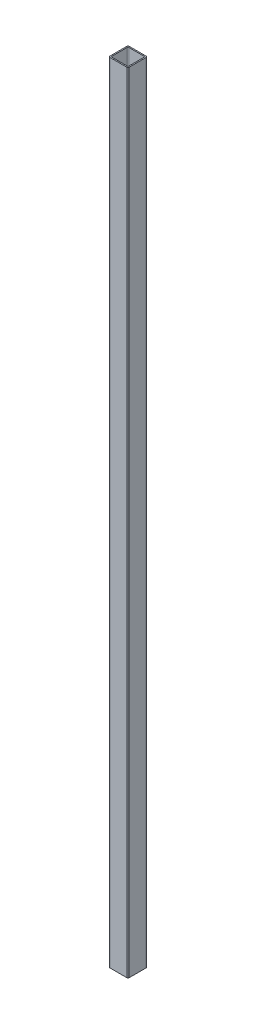
ISO-10303-21;
HEADER;
FILE_DESCRIPTION(('STEP AP214'),'2;1');
FILE_NAME('part.step','',(''),(''),'','','');
FILE_SCHEMA(('AUTOMOTIVE_DESIGN { 1 0 10303 214 1 1 1 1 }'));
ENDSEC;
DATA;
#1=APPLICATION_CONTEXT('core data for automotive mechanical design processes');
#2=APPLICATION_PROTOCOL_DEFINITION('international standard','automotive_design',2000,#1);
#3=PRODUCT_CONTEXT('',#1,'mechanical');
#4=PRODUCT('Part','Part','',(#3));
#5=PRODUCT_RELATED_PRODUCT_CATEGORY('part','',(#4));
#6=PRODUCT_DEFINITION_FORMATION('','',#4);
#7=PRODUCT_DEFINITION_CONTEXT('part definition',#1,'design');
#8=PRODUCT_DEFINITION('design','',#6,#7);
#9=PRODUCT_DEFINITION_SHAPE('','',#8);
#10=(LENGTH_UNIT() NAMED_UNIT(*) SI_UNIT(.MILLI.,.METRE.));
#11=(NAMED_UNIT(*) PLANE_ANGLE_UNIT() SI_UNIT($,.RADIAN.));
#12=(NAMED_UNIT(*) SI_UNIT($,.STERADIAN.) SOLID_ANGLE_UNIT());
#13=UNCERTAINTY_MEASURE_WITH_UNIT(LENGTH_MEASURE(1.E-05),#10,'distance_accuracy_value','');
#14=(GEOMETRIC_REPRESENTATION_CONTEXT(3) GLOBAL_UNCERTAINTY_ASSIGNED_CONTEXT((#13)) GLOBAL_UNIT_ASSIGNED_CONTEXT((#10,
#11,#12)) REPRESENTATION_CONTEXT('',''));
#15=CARTESIAN_POINT('',(0.,0.,0.));
#16=DIRECTION('',(0.,0.,1.));
#17=DIRECTION('',(1.,0.,0.));
#18=AXIS2_PLACEMENT_3D('',#15,#16,#17);
#19=CARTESIAN_POINT('',(3.,0.,22.));
#20=DIRECTION('',(0.,1.,0.));
#21=DIRECTION('',(0.,0.,1.));
#22=AXIS2_PLACEMENT_3D('',#19,#20,#21);
#23=PLANE('',#22);
#24=CARTESIAN_POINT('',(3.,0.,22.));
#25=DIRECTION('',(0.,1.,0.));
#26=DIRECTION('',(0.,0.,1.));
#27=AXIS2_PLACEMENT_3D('',#24,#25,#26);
#28=CIRCLE('',#27,3.);
#29=CARTESIAN_POINT('',(0.,0.,22.));
#30=VERTEX_POINT('',#29);
#31=CARTESIAN_POINT('',(3.,0.,25.));
#32=VERTEX_POINT('',#31);
#33=EDGE_CURVE('E176',#30,#32,#28,.T.);
#34=ORIENTED_EDGE('',*,*,#33,.F.);
#35=DIRECTION('',(0.,0.,1.));
#36=VECTOR('',#35,1.);
#37=CARTESIAN_POINT('',(0.,0.,-22.));
#38=LINE('',#37,#36);
#39=CARTESIAN_POINT('',(0.,0.,-22.));
#40=VERTEX_POINT('',#39);
#41=EDGE_CURVE('E130',#40,#30,#38,.T.);
#42=ORIENTED_EDGE('',*,*,#41,.F.);
#43=CARTESIAN_POINT('',(3.,0.,-22.));
#44=DIRECTION('',(0.,1.,0.));
#45=DIRECTION('',(0.,0.,1.));
#46=AXIS2_PLACEMENT_3D('',#43,#44,#45);
#47=CIRCLE('',#46,3.);
#48=CARTESIAN_POINT('',(3.,0.,-25.));
#49=VERTEX_POINT('',#48);
#50=EDGE_CURVE('E170',#49,#40,#47,.T.);
#51=ORIENTED_EDGE('',*,*,#50,.F.);
#52=DIRECTION('',(-1.,0.,0.));
#53=VECTOR('',#52,1.);
#54=CARTESIAN_POINT('',(3.,0.,-25.));
#55=LINE('',#54,#53);
#56=CARTESIAN_POINT('',(47.,0.,-25.));
#57=VERTEX_POINT('',#56);
#58=EDGE_CURVE('E166',#57,#49,#55,.T.);
#59=ORIENTED_EDGE('',*,*,#58,.F.);
#60=CARTESIAN_POINT('',(47.,0.,-22.));
#61=DIRECTION('',(0.,1.,0.));
#62=DIRECTION('',(0.,0.,-1.));
#63=AXIS2_PLACEMENT_3D('',#60,#61,#62);
#64=CIRCLE('',#63,3.00000000000001);
#65=CARTESIAN_POINT('',(50.,0.,-22.));
#66=VERTEX_POINT('',#65);
#67=EDGE_CURVE('E162',#66,#57,#64,.T.);
#68=ORIENTED_EDGE('',*,*,#67,.F.);
#69=DIRECTION('',(0.,0.,-1.));
#70=VECTOR('',#69,1.);
#71=CARTESIAN_POINT('',(50.,0.,-22.));
#72=LINE('',#71,#70);
#73=CARTESIAN_POINT('',(50.,0.,22.));
#74=VERTEX_POINT('',#73);
#75=EDGE_CURVE('E158',#74,#66,#72,.T.);
#76=ORIENTED_EDGE('',*,*,#75,.F.);
#77=CARTESIAN_POINT('',(47.,0.,22.));
#78=DIRECTION('',(0.,1.,0.));
#79=DIRECTION('',(0.,0.,1.));
#80=AXIS2_PLACEMENT_3D('',#77,#78,#79);
#81=CIRCLE('',#80,3.);
#82=CARTESIAN_POINT('',(47.,0.,25.));
#83=VERTEX_POINT('',#82);
#84=EDGE_CURVE('E154',#83,#74,#81,.T.);
#85=ORIENTED_EDGE('',*,*,#84,.F.);
#86=DIRECTION('',(1.,0.,0.));
#87=VECTOR('',#86,1.);
#88=CARTESIAN_POINT('',(3.,0.,25.));
#89=LINE('',#88,#87);
#90=EDGE_CURVE('E150',#32,#83,#89,.T.);
#91=ORIENTED_EDGE('',*,*,#90,.F.);
#92=EDGE_LOOP('',(#34,#42,#51,#59,#68,#76,#85,#91));
#93=FACE_BOUND('',#92,.T.);
#94=CARTESIAN_POINT('',(5.00000000000001,0.,20.));
#95=DIRECTION('',(0.,1.,0.));
#96=DIRECTION('',(0.,0.,1.));
#97=AXIS2_PLACEMENT_3D('',#94,#95,#96);
#98=CIRCLE('',#97,2.);
#99=CARTESIAN_POINT('',(3.00000000000001,0.,20.));
#100=VERTEX_POINT('',#99);
#101=CARTESIAN_POINT('',(5.00000000000001,0.,22.));
#102=VERTEX_POINT('',#101);
#103=EDGE_CURVE('E126',#100,#102,#98,.T.);
#104=ORIENTED_EDGE('',*,*,#103,.T.);
#105=DIRECTION('',(1.,0.,0.));
#106=VECTOR('',#105,1.);
#107=CARTESIAN_POINT('',(5.00000000000001,0.,22.));
#108=LINE('',#107,#106);
#109=CARTESIAN_POINT('',(45.,0.,22.));
#110=VERTEX_POINT('',#109);
#111=EDGE_CURVE('E133',#102,#110,#108,.T.);
#112=ORIENTED_EDGE('',*,*,#111,.T.);
#113=CARTESIAN_POINT('',(45.,0.,20.));
#114=DIRECTION('',(0.,1.,0.));
#115=DIRECTION('',(0.,0.,1.));
#116=AXIS2_PLACEMENT_3D('',#113,#114,#115);
#117=CIRCLE('',#116,2.);
#118=CARTESIAN_POINT('',(47.,0.,20.));
#119=VERTEX_POINT('',#118);
#120=EDGE_CURVE('E137',#110,#119,#117,.T.);
#121=ORIENTED_EDGE('',*,*,#120,.T.);
#122=DIRECTION('',(0.,0.,-1.));
#123=VECTOR('',#122,1.);
#124=CARTESIAN_POINT('',(47.,0.,-20.));
#125=LINE('',#124,#123);
#126=CARTESIAN_POINT('',(47.,0.,-20.));
#127=VERTEX_POINT('',#126);
#128=EDGE_CURVE('E242',#119,#127,#125,.T.);
#129=ORIENTED_EDGE('',*,*,#128,.T.);
#130=CARTESIAN_POINT('',(45.,0.,-20.));
#131=DIRECTION('',(0.,1.,0.));
#132=DIRECTION('',(0.,0.,-1.));
#133=AXIS2_PLACEMENT_3D('',#130,#131,#132);
#134=CIRCLE('',#133,2.);
#135=CARTESIAN_POINT('',(45.,0.,-22.));
#136=VERTEX_POINT('',#135);
#137=EDGE_CURVE('E240',#127,#136,#134,.T.);
#138=ORIENTED_EDGE('',*,*,#137,.T.);
#139=DIRECTION('',(-1.,0.,0.));
#140=VECTOR('',#139,1.);
#141=CARTESIAN_POINT('',(5.00000000000001,0.,-22.));
#142=LINE('',#141,#140);
#143=CARTESIAN_POINT('',(5.00000000000001,0.,-22.));
#144=VERTEX_POINT('',#143);
#145=EDGE_CURVE('E235',#136,#144,#142,.T.);
#146=ORIENTED_EDGE('',*,*,#145,.T.);
#147=CARTESIAN_POINT('',(5.00000000000001,0.,-20.));
#148=DIRECTION('',(0.,1.,0.));
#149=DIRECTION('',(0.,0.,1.));
#150=AXIS2_PLACEMENT_3D('',#147,#148,#149);
#151=CIRCLE('',#150,2.);
#152=CARTESIAN_POINT('',(3.00000000000001,0.,-20.));
#153=VERTEX_POINT('',#152);
#154=EDGE_CURVE('E233',#144,#153,#151,.T.);
#155=ORIENTED_EDGE('',*,*,#154,.T.);
#156=DIRECTION('',(0.,0.,1.));
#157=VECTOR('',#156,1.);
#158=CARTESIAN_POINT('',(3.00000000000001,0.,-20.));
#159=LINE('',#158,#157);
#160=EDGE_CURVE('E141',#153,#100,#159,.T.);
#161=ORIENTED_EDGE('',*,*,#160,.T.);
#162=EDGE_LOOP('',(#104,#112,#121,#129,#138,#146,#155,#161));
#163=FACE_BOUND('',#162,.T.);
#164=ADVANCED_FACE('F35',(#93,#163),#23,.F.);
#165=CARTESIAN_POINT('',(3.,2115.71067811865,22.));
#166=DIRECTION('',(0.,-1.,0.));
#167=DIRECTION('',(0.,0.,-1.));
#168=AXIS2_PLACEMENT_3D('',#165,#166,#167);
#169=CYLINDRICAL_SURFACE('',#168,3.);
#170=DIRECTION('',(0.,-1.,0.));
#171=VECTOR('',#170,1.);
#172=CARTESIAN_POINT('',(3.,2115.71067811865,25.));
#173=LINE('',#172,#171);
#174=CARTESIAN_POINT('',(3.,2045.,25.));
#175=VERTEX_POINT('',#174);
#176=EDGE_CURVE('E148',#175,#32,#173,.T.);
#177=ORIENTED_EDGE('',*,*,#176,.F.);
#178=CARTESIAN_POINT('',(3.,2045.,22.));
#179=DIRECTION('',(0.,-1.,0.));
#180=DIRECTION('',(0.,0.,-1.));
#181=AXIS2_PLACEMENT_3D('',#178,#179,#180);
#182=CIRCLE('',#181,3.);
#183=CARTESIAN_POINT('',(0.,2045.,22.));
#184=VERTEX_POINT('',#183);
#185=EDGE_CURVE('E54',#175,#184,#182,.T.);
#186=ORIENTED_EDGE('',*,*,#185,.T.);
#187=DIRECTION('',(0.,-1.,0.));
#188=VECTOR('',#187,1.);
#189=CARTESIAN_POINT('',(0.,2115.71067811865,22.));
#190=LINE('',#189,#188);
#191=EDGE_CURVE('E175',#184,#30,#190,.T.);
#192=ORIENTED_EDGE('',*,*,#191,.T.);
#193=ORIENTED_EDGE('',*,*,#33,.T.);
#194=EDGE_LOOP('',(#177,#186,#192,#193));
#195=FACE_BOUND('',#194,.T.);
#196=ADVANCED_FACE('F311',(#195),#169,.T.);
#197=CARTESIAN_POINT('',(3.,2115.71067811865,25.));
#198=DIRECTION('',(0.,0.,-1.));
#199=DIRECTION('',(-1.,0.,0.));
#200=AXIS2_PLACEMENT_3D('',#197,#198,#199);
#201=PLANE('',#200);
#202=DIRECTION('',(0.,-1.,0.));
#203=VECTOR('',#202,1.);
#204=CARTESIAN_POINT('',(47.,2115.71067811865,25.));
#205=LINE('',#204,#203);
#206=CARTESIAN_POINT('',(47.,2045.,25.));
#207=VERTEX_POINT('',#206);
#208=EDGE_CURVE('E152',#207,#83,#205,.T.);
#209=ORIENTED_EDGE('',*,*,#208,.F.);
#210=DIRECTION('',(-1.,0.,0.));
#211=VECTOR('',#210,1.);
#212=CARTESIAN_POINT('',(3.,2045.,25.));
#213=LINE('',#212,#211);
#214=EDGE_CURVE('E151',#207,#175,#213,.T.);
#215=ORIENTED_EDGE('',*,*,#214,.T.);
#216=ORIENTED_EDGE('',*,*,#176,.T.);
#217=ORIENTED_EDGE('',*,*,#90,.T.);
#218=EDGE_LOOP('',(#209,#215,#216,#217));
#219=FACE_BOUND('',#218,.T.);
#220=ADVANCED_FACE('F282',(#219),#201,.F.);
#221=CARTESIAN_POINT('',(47.,2115.71067811865,22.));
#222=DIRECTION('',(0.,-1.,0.));
#223=DIRECTION('',(0.,0.,-1.));
#224=AXIS2_PLACEMENT_3D('',#221,#222,#223);
#225=CYLINDRICAL_SURFACE('',#224,3.);
#226=DIRECTION('',(0.,-1.,0.));
#227=VECTOR('',#226,1.);
#228=CARTESIAN_POINT('',(50.,2115.71067811865,22.));
#229=LINE('',#228,#227);
#230=CARTESIAN_POINT('',(50.,2045.,22.));
#231=VERTEX_POINT('',#230);
#232=EDGE_CURVE('E156',#231,#74,#229,.T.);
#233=ORIENTED_EDGE('',*,*,#232,.F.);
#234=CARTESIAN_POINT('',(47.,2045.,22.));
#235=DIRECTION('',(0.,-1.,0.));
#236=DIRECTION('',(0.,0.,-1.));
#237=AXIS2_PLACEMENT_3D('',#234,#235,#236);
#238=CIRCLE('',#237,3.);
#239=EDGE_CURVE('E155',#231,#207,#238,.T.);
#240=ORIENTED_EDGE('',*,*,#239,.T.);
#241=ORIENTED_EDGE('',*,*,#208,.T.);
#242=ORIENTED_EDGE('',*,*,#84,.T.);
#243=EDGE_LOOP('',(#233,#240,#241,#242));
#244=FACE_BOUND('',#243,.T.);
#245=ADVANCED_FACE('F287',(#244),#225,.T.);
#246=CARTESIAN_POINT('',(50.,2115.71067811865,-22.));
#247=DIRECTION('',(-1.,0.,0.));
#248=DIRECTION('',(0.,0.,1.));
#249=AXIS2_PLACEMENT_3D('',#246,#247,#248);
#250=PLANE('',#249);
#251=DIRECTION('',(0.,-1.,0.));
#252=VECTOR('',#251,1.);
#253=CARTESIAN_POINT('',(50.,2115.71067811865,-22.));
#254=LINE('',#253,#252);
#255=CARTESIAN_POINT('',(50.,2045.,-22.));
#256=VERTEX_POINT('',#255);
#257=EDGE_CURVE('E160',#256,#66,#254,.T.);
#258=ORIENTED_EDGE('',*,*,#257,.F.);
#259=DIRECTION('',(0.,0.,1.));
#260=VECTOR('',#259,1.);
#261=CARTESIAN_POINT('',(50.,2045.,-22.));
#262=LINE('',#261,#260);
#263=EDGE_CURVE('E159',#256,#231,#262,.T.);
#264=ORIENTED_EDGE('',*,*,#263,.T.);
#265=ORIENTED_EDGE('',*,*,#232,.T.);
#266=ORIENTED_EDGE('',*,*,#75,.T.);
#267=EDGE_LOOP('',(#258,#264,#265,#266));
#268=FACE_BOUND('',#267,.T.);
#269=ADVANCED_FACE('F292',(#268),#250,.F.);
#270=CARTESIAN_POINT('',(47.,2115.71067811865,-22.));
#271=DIRECTION('',(0.,-1.,0.));
#272=DIRECTION('',(0.,0.,-1.));
#273=AXIS2_PLACEMENT_3D('',#270,#271,#272);
#274=CYLINDRICAL_SURFACE('',#273,3.00000000000001);
#275=DIRECTION('',(0.,-1.,0.));
#276=VECTOR('',#275,1.);
#277=CARTESIAN_POINT('',(47.,2115.71067811865,-25.));
#278=LINE('',#277,#276);
#279=CARTESIAN_POINT('',(47.,2045.,-25.));
#280=VERTEX_POINT('',#279);
#281=EDGE_CURVE('E164',#280,#57,#278,.T.);
#282=ORIENTED_EDGE('',*,*,#281,.F.);
#283=CARTESIAN_POINT('',(47.,2045.,-22.));
#284=DIRECTION('',(0.,-1.,0.));
#285=DIRECTION('',(0.,0.,-1.));
#286=AXIS2_PLACEMENT_3D('',#283,#284,#285);
#287=CIRCLE('',#286,3.00000000000001);
#288=EDGE_CURVE('E163',#280,#256,#287,.T.);
#289=ORIENTED_EDGE('',*,*,#288,.T.);
#290=ORIENTED_EDGE('',*,*,#257,.T.);
#291=ORIENTED_EDGE('',*,*,#67,.T.);
#292=EDGE_LOOP('',(#282,#289,#290,#291));
#293=FACE_BOUND('',#292,.T.);
#294=ADVANCED_FACE('F297',(#293),#274,.T.);
#295=CARTESIAN_POINT('',(3.,2115.71067811865,-25.));
#296=DIRECTION('',(0.,0.,1.));
#297=DIRECTION('',(1.,0.,0.));
#298=AXIS2_PLACEMENT_3D('',#295,#296,#297);
#299=PLANE('',#298);
#300=DIRECTION('',(0.,-1.,0.));
#301=VECTOR('',#300,1.);
#302=CARTESIAN_POINT('',(3.,2115.71067811865,-25.));
#303=LINE('',#302,#301);
#304=CARTESIAN_POINT('',(3.,2045.,-25.));
#305=VERTEX_POINT('',#304);
#306=EDGE_CURVE('E168',#305,#49,#303,.T.);
#307=ORIENTED_EDGE('',*,*,#306,.F.);
#308=DIRECTION('',(1.,0.,0.));
#309=VECTOR('',#308,1.);
#310=CARTESIAN_POINT('',(3.,2045.,-25.));
#311=LINE('',#310,#309);
#312=EDGE_CURVE('E167',#305,#280,#311,.T.);
#313=ORIENTED_EDGE('',*,*,#312,.T.);
#314=ORIENTED_EDGE('',*,*,#281,.T.);
#315=ORIENTED_EDGE('',*,*,#58,.T.);
#316=EDGE_LOOP('',(#307,#313,#314,#315));
#317=FACE_BOUND('',#316,.T.);
#318=ADVANCED_FACE('F302',(#317),#299,.F.);
#319=CARTESIAN_POINT('',(3.,2115.71067811865,-22.));
#320=DIRECTION('',(0.,-1.,0.));
#321=DIRECTION('',(0.,0.,-1.));
#322=AXIS2_PLACEMENT_3D('',#319,#320,#321);
#323=CYLINDRICAL_SURFACE('',#322,3.);
#324=DIRECTION('',(0.,-1.,0.));
#325=VECTOR('',#324,1.);
#326=CARTESIAN_POINT('',(0.,2115.71067811865,-22.));
#327=LINE('',#326,#325);
#328=CARTESIAN_POINT('',(0.,2045.,-22.));
#329=VERTEX_POINT('',#328);
#330=EDGE_CURVE('E172',#329,#40,#327,.T.);
#331=ORIENTED_EDGE('',*,*,#330,.F.);
#332=CARTESIAN_POINT('',(3.,2045.,-22.));
#333=DIRECTION('',(0.,-1.,0.));
#334=DIRECTION('',(0.,0.,-1.));
#335=AXIS2_PLACEMENT_3D('',#332,#333,#334);
#336=CIRCLE('',#335,3.);
#337=EDGE_CURVE('E171',#329,#305,#336,.T.);
#338=ORIENTED_EDGE('',*,*,#337,.T.);
#339=ORIENTED_EDGE('',*,*,#306,.T.);
#340=ORIENTED_EDGE('',*,*,#50,.T.);
#341=EDGE_LOOP('',(#331,#338,#339,#340));
#342=FACE_BOUND('',#341,.T.);
#343=ADVANCED_FACE('F307',(#342),#323,.T.);
#344=CARTESIAN_POINT('',(0.,2115.71067811865,-22.));
#345=DIRECTION('',(1.,0.,0.));
#346=DIRECTION('',(0.,0.,-1.));
#347=AXIS2_PLACEMENT_3D('',#344,#345,#346);
#348=PLANE('',#347);
#349=ORIENTED_EDGE('',*,*,#191,.F.);
#350=DIRECTION('',(0.,0.,-1.));
#351=VECTOR('',#350,1.);
#352=CARTESIAN_POINT('',(0.,2045.,-22.));
#353=LINE('',#352,#351);
#354=EDGE_CURVE('E174',#184,#329,#353,.T.);
#355=ORIENTED_EDGE('',*,*,#354,.T.);
#356=ORIENTED_EDGE('',*,*,#330,.T.);
#357=ORIENTED_EDGE('',*,*,#41,.T.);
#358=EDGE_LOOP('',(#349,#355,#356,#357));
#359=FACE_BOUND('',#358,.T.);
#360=ADVANCED_FACE('F314',(#359),#348,.F.);
#361=CARTESIAN_POINT('',(5.00000000000001,2115.71067811865,20.));
#362=DIRECTION('',(0.,-1.,0.));
#363=DIRECTION('',(0.,0.,-1.));
#364=AXIS2_PLACEMENT_3D('',#361,#362,#363);
#365=CYLINDRICAL_SURFACE('',#364,2.);
#366=CARTESIAN_POINT('',(5.00000000000001,2045.,20.));
#367=DIRECTION('',(0.,-1.,0.));
#368=DIRECTION('',(0.,0.,-1.));
#369=AXIS2_PLACEMENT_3D('',#366,#367,#368);
#370=CIRCLE('',#369,2.);
#371=CARTESIAN_POINT('',(5.00000000000001,2045.,22.));
#372=VERTEX_POINT('',#371);
#373=CARTESIAN_POINT('',(3.00000000000001,2045.,20.));
#374=VERTEX_POINT('',#373);
#375=EDGE_CURVE('E129',#372,#374,#370,.T.);
#376=ORIENTED_EDGE('',*,*,#375,.F.);
#377=DIRECTION('',(0.,-1.,0.));
#378=VECTOR('',#377,1.);
#379=CARTESIAN_POINT('',(5.00000000000001,2115.71067811865,22.));
#380=LINE('',#379,#378);
#381=EDGE_CURVE('E122',#372,#102,#380,.T.);
#382=ORIENTED_EDGE('',*,*,#381,.T.);
#383=ORIENTED_EDGE('',*,*,#103,.F.);
#384=DIRECTION('',(0.,-1.,0.));
#385=VECTOR('',#384,1.);
#386=CARTESIAN_POINT('',(3.00000000000001,2115.71067811865,20.));
#387=LINE('',#386,#385);
#388=EDGE_CURVE('E189',#374,#100,#387,.T.);
#389=ORIENTED_EDGE('',*,*,#388,.F.);
#390=EDGE_LOOP('',(#376,#382,#383,#389));
#391=FACE_BOUND('',#390,.T.);
#392=ADVANCED_FACE('F123',(#391),#365,.F.);
#393=CARTESIAN_POINT('',(5.00000000000001,2115.71067811865,22.));
#394=DIRECTION('',(0.,0.,-1.));
#395=DIRECTION('',(-1.,0.,0.));
#396=AXIS2_PLACEMENT_3D('',#393,#394,#395);
#397=PLANE('',#396);
#398=DIRECTION('',(-1.,0.,0.));
#399=VECTOR('',#398,1.);
#400=CARTESIAN_POINT('',(5.00000000000001,2045.,22.));
#401=LINE('',#400,#399);
#402=CARTESIAN_POINT('',(45.,2045.,22.));
#403=VERTEX_POINT('',#402);
#404=EDGE_CURVE('E11',#403,#372,#401,.T.);
#405=ORIENTED_EDGE('',*,*,#404,.F.);
#406=DIRECTION('',(0.,-1.,0.));
#407=VECTOR('',#406,1.);
#408=CARTESIAN_POINT('',(45.,2115.71067811865,22.));
#409=LINE('',#408,#407);
#410=EDGE_CURVE('E115',#403,#110,#409,.T.);
#411=ORIENTED_EDGE('',*,*,#410,.T.);
#412=ORIENTED_EDGE('',*,*,#111,.F.);
#413=ORIENTED_EDGE('',*,*,#381,.F.);
#414=EDGE_LOOP('',(#405,#411,#412,#413));
#415=FACE_BOUND('',#414,.T.);
#416=ADVANCED_FACE('F134',(#415),#397,.T.);
#417=CARTESIAN_POINT('',(45.,2115.71067811865,20.));
#418=DIRECTION('',(0.,-1.,0.));
#419=DIRECTION('',(0.,0.,-1.));
#420=AXIS2_PLACEMENT_3D('',#417,#418,#419);
#421=CYLINDRICAL_SURFACE('',#420,2.);
#422=CARTESIAN_POINT('',(45.,2045.,20.));
#423=DIRECTION('',(0.,-1.,0.));
#424=DIRECTION('',(0.,0.,-1.));
#425=AXIS2_PLACEMENT_3D('',#422,#423,#424);
#426=CIRCLE('',#425,2.);
#427=CARTESIAN_POINT('',(47.,2045.,20.));
#428=VERTEX_POINT('',#427);
#429=EDGE_CURVE('E45',#428,#403,#426,.T.);
#430=ORIENTED_EDGE('',*,*,#429,.F.);
#431=DIRECTION('',(0.,-1.,0.));
#432=VECTOR('',#431,1.);
#433=CARTESIAN_POINT('',(47.,2115.71067811865,20.));
#434=LINE('',#433,#432);
#435=EDGE_CURVE('E179',#428,#119,#434,.T.);
#436=ORIENTED_EDGE('',*,*,#435,.T.);
#437=ORIENTED_EDGE('',*,*,#120,.F.);
#438=ORIENTED_EDGE('',*,*,#410,.F.);
#439=EDGE_LOOP('',(#430,#436,#437,#438));
#440=FACE_BOUND('',#439,.T.);
#441=ADVANCED_FACE('F249',(#440),#421,.F.);
#442=CARTESIAN_POINT('',(47.,2115.71067811865,-20.));
#443=DIRECTION('',(-1.,0.,0.));
#444=DIRECTION('',(0.,0.,1.));
#445=AXIS2_PLACEMENT_3D('',#442,#443,#444);
#446=PLANE('',#445);
#447=DIRECTION('',(0.,0.,1.));
#448=VECTOR('',#447,1.);
#449=CARTESIAN_POINT('',(47.,2045.,-20.));
#450=LINE('',#449,#448);
#451=CARTESIAN_POINT('',(47.,2045.,-20.));
#452=VERTEX_POINT('',#451);
#453=EDGE_CURVE('E209',#452,#428,#450,.T.);
#454=ORIENTED_EDGE('',*,*,#453,.F.);
#455=DIRECTION('',(0.,-1.,0.));
#456=VECTOR('',#455,1.);
#457=CARTESIAN_POINT('',(47.,2115.71067811865,-20.));
#458=LINE('',#457,#456);
#459=EDGE_CURVE('E181',#452,#127,#458,.T.);
#460=ORIENTED_EDGE('',*,*,#459,.T.);
#461=ORIENTED_EDGE('',*,*,#128,.F.);
#462=ORIENTED_EDGE('',*,*,#435,.F.);
#463=EDGE_LOOP('',(#454,#460,#461,#462));
#464=FACE_BOUND('',#463,.T.);
#465=ADVANCED_FACE('F255',(#464),#446,.T.);
#466=CARTESIAN_POINT('',(45.,2115.71067811865,-20.));
#467=DIRECTION('',(0.,-1.,0.));
#468=DIRECTION('',(0.,0.,-1.));
#469=AXIS2_PLACEMENT_3D('',#466,#467,#468);
#470=CYLINDRICAL_SURFACE('',#469,2.);
#471=CARTESIAN_POINT('',(45.,2045.,-20.));
#472=DIRECTION('',(0.,-1.,0.));
#473=DIRECTION('',(0.,0.,-1.));
#474=AXIS2_PLACEMENT_3D('',#471,#472,#473);
#475=CIRCLE('',#474,2.);
#476=CARTESIAN_POINT('',(45.,2045.,-22.));
#477=VERTEX_POINT('',#476);
#478=EDGE_CURVE('E212',#477,#452,#475,.T.);
#479=ORIENTED_EDGE('',*,*,#478,.F.);
#480=DIRECTION('',(0.,-1.,0.));
#481=VECTOR('',#480,1.);
#482=CARTESIAN_POINT('',(45.,2115.71067811865,-22.));
#483=LINE('',#482,#481);
#484=EDGE_CURVE('E183',#477,#136,#483,.T.);
#485=ORIENTED_EDGE('',*,*,#484,.T.);
#486=ORIENTED_EDGE('',*,*,#137,.F.);
#487=ORIENTED_EDGE('',*,*,#459,.F.);
#488=EDGE_LOOP('',(#479,#485,#486,#487));
#489=FACE_BOUND('',#488,.T.);
#490=ADVANCED_FACE('F259',(#489),#470,.F.);
#491=CARTESIAN_POINT('',(5.00000000000001,2115.71067811865,-22.));
#492=DIRECTION('',(0.,0.,1.));
#493=DIRECTION('',(1.,0.,0.));
#494=AXIS2_PLACEMENT_3D('',#491,#492,#493);
#495=PLANE('',#494);
#496=DIRECTION('',(1.,0.,0.));
#497=VECTOR('',#496,1.);
#498=CARTESIAN_POINT('',(5.00000000000001,2045.,-22.));
#499=LINE('',#498,#497);
#500=CARTESIAN_POINT('',(5.00000000000001,2045.,-22.));
#501=VERTEX_POINT('',#500);
#502=EDGE_CURVE('E214',#501,#477,#499,.T.);
#503=ORIENTED_EDGE('',*,*,#502,.F.);
#504=DIRECTION('',(0.,-1.,0.));
#505=VECTOR('',#504,1.);
#506=CARTESIAN_POINT('',(5.00000000000001,2115.71067811865,-22.));
#507=LINE('',#506,#505);
#508=EDGE_CURVE('E185',#501,#144,#507,.T.);
#509=ORIENTED_EDGE('',*,*,#508,.T.);
#510=ORIENTED_EDGE('',*,*,#145,.F.);
#511=ORIENTED_EDGE('',*,*,#484,.F.);
#512=EDGE_LOOP('',(#503,#509,#510,#511));
#513=FACE_BOUND('',#512,.T.);
#514=ADVANCED_FACE('F229',(#513),#495,.T.);
#515=CARTESIAN_POINT('',(5.00000000000001,2115.71067811865,-20.));
#516=DIRECTION('',(0.,-1.,0.));
#517=DIRECTION('',(0.,0.,-1.));
#518=AXIS2_PLACEMENT_3D('',#515,#516,#517);
#519=CYLINDRICAL_SURFACE('',#518,2.);
#520=CARTESIAN_POINT('',(5.00000000000001,2045.,-20.));
#521=DIRECTION('',(0.,-1.,0.));
#522=DIRECTION('',(0.,0.,-1.));
#523=AXIS2_PLACEMENT_3D('',#520,#521,#522);
#524=CIRCLE('',#523,2.);
#525=CARTESIAN_POINT('',(3.00000000000001,2045.,-20.));
#526=VERTEX_POINT('',#525);
#527=EDGE_CURVE('E39',#526,#501,#524,.T.);
#528=ORIENTED_EDGE('',*,*,#527,.F.);
#529=DIRECTION('',(0.,-1.,0.));
#530=VECTOR('',#529,1.);
#531=CARTESIAN_POINT('',(3.00000000000001,2115.71067811865,-20.));
#532=LINE('',#531,#530);
#533=EDGE_CURVE('E187',#526,#153,#532,.T.);
#534=ORIENTED_EDGE('',*,*,#533,.T.);
#535=ORIENTED_EDGE('',*,*,#154,.F.);
#536=ORIENTED_EDGE('',*,*,#508,.F.);
#537=EDGE_LOOP('',(#528,#534,#535,#536));
#538=FACE_BOUND('',#537,.T.);
#539=ADVANCED_FACE('F232',(#538),#519,.F.);
#540=CARTESIAN_POINT('',(3.00000000000001,2115.71067811865,-20.));
#541=DIRECTION('',(1.,0.,0.));
#542=DIRECTION('',(0.,0.,-1.));
#543=AXIS2_PLACEMENT_3D('',#540,#541,#542);
#544=PLANE('',#543);
#545=DIRECTION('',(0.,0.,-1.));
#546=VECTOR('',#545,1.);
#547=CARTESIAN_POINT('',(3.00000000000001,2045.,-20.));
#548=LINE('',#547,#546);
#549=EDGE_CURVE('E145',#374,#526,#548,.T.);
#550=ORIENTED_EDGE('',*,*,#549,.F.);
#551=ORIENTED_EDGE('',*,*,#388,.T.);
#552=ORIENTED_EDGE('',*,*,#160,.F.);
#553=ORIENTED_EDGE('',*,*,#533,.F.);
#554=EDGE_LOOP('',(#550,#551,#552,#553));
#555=FACE_BOUND('',#554,.T.);
#556=ADVANCED_FACE('F347',(#555),#544,.T.);
#557=CARTESIAN_POINT('',(492.500000000008,2045.,-22.));
#558=DIRECTION('',(0.,-1.,0.));
#559=DIRECTION('',(1.,0.,0.));
#560=AXIS2_PLACEMENT_3D('',#557,#558,#559);
#561=PLANE('',#560);
#562=ORIENTED_EDGE('',*,*,#375,.T.);
#563=ORIENTED_EDGE('',*,*,#549,.T.);
#564=ORIENTED_EDGE('',*,*,#527,.T.);
#565=ORIENTED_EDGE('',*,*,#502,.T.);
#566=ORIENTED_EDGE('',*,*,#478,.T.);
#567=ORIENTED_EDGE('',*,*,#453,.T.);
#568=ORIENTED_EDGE('',*,*,#429,.T.);
#569=ORIENTED_EDGE('',*,*,#404,.T.);
#570=EDGE_LOOP('',(#562,#563,#564,#565,#566,#567,#568,#569));
#571=FACE_BOUND('',#570,.T.);
#572=ORIENTED_EDGE('',*,*,#214,.F.);
#573=ORIENTED_EDGE('',*,*,#239,.F.);
#574=ORIENTED_EDGE('',*,*,#263,.F.);
#575=ORIENTED_EDGE('',*,*,#288,.F.);
#576=ORIENTED_EDGE('',*,*,#312,.F.);
#577=ORIENTED_EDGE('',*,*,#337,.F.);
#578=ORIENTED_EDGE('',*,*,#354,.F.);
#579=ORIENTED_EDGE('',*,*,#185,.F.);
#580=EDGE_LOOP('',(#572,#573,#574,#575,#576,#577,#578,#579));
#581=FACE_BOUND('',#580,.T.);
#582=ADVANCED_FACE('F37',(#571,#581),#561,.F.);
#583=CLOSED_SHELL('',(#164,#196,#220,#245,#269,#294,#318,#343,#360,#392,#416,#441,#465,#490,
#514,#539,#556,#582));
#584=MANIFOLD_SOLID_BREP('B2',#583);
#585=ADVANCED_BREP_SHAPE_REPRESENTATION('',(#18,#584),#14);
#586=SHAPE_DEFINITION_REPRESENTATION(#9,#585);
ENDSEC;
END-ISO-10303-21;
